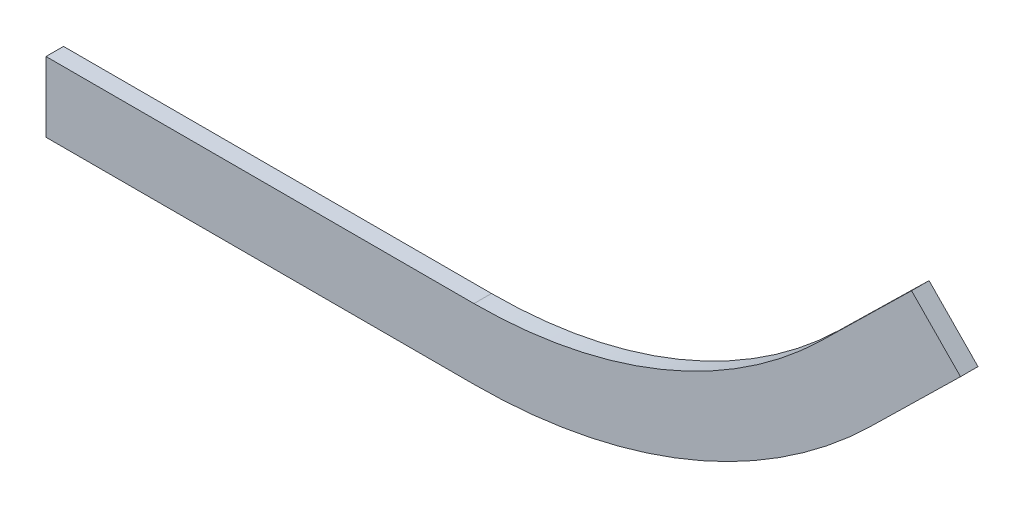
ISO-10303-21;
HEADER;
FILE_DESCRIPTION(('STEP AP214'),'2;1');
FILE_NAME('part.step','',(''),(''),'','','');
FILE_SCHEMA(('AUTOMOTIVE_DESIGN { 1 0 10303 214 1 1 1 1 }'));
ENDSEC;
DATA;
#1=APPLICATION_CONTEXT('core data for automotive mechanical design processes');
#2=APPLICATION_PROTOCOL_DEFINITION('international standard','automotive_design',2000,#1);
#3=PRODUCT_CONTEXT('',#1,'mechanical');
#4=PRODUCT('Part','Part','',(#3));
#5=PRODUCT_RELATED_PRODUCT_CATEGORY('part','',(#4));
#6=PRODUCT_DEFINITION_FORMATION('','',#4);
#7=PRODUCT_DEFINITION_CONTEXT('part definition',#1,'design');
#8=PRODUCT_DEFINITION('design','',#6,#7);
#9=PRODUCT_DEFINITION_SHAPE('','',#8);
#10=(LENGTH_UNIT() NAMED_UNIT(*) SI_UNIT(.MILLI.,.METRE.));
#11=(NAMED_UNIT(*) PLANE_ANGLE_UNIT() SI_UNIT($,.RADIAN.));
#12=(NAMED_UNIT(*) SI_UNIT($,.STERADIAN.) SOLID_ANGLE_UNIT());
#13=UNCERTAINTY_MEASURE_WITH_UNIT(LENGTH_MEASURE(1.E-05),#10,'distance_accuracy_value','');
#14=(GEOMETRIC_REPRESENTATION_CONTEXT(3) GLOBAL_UNCERTAINTY_ASSIGNED_CONTEXT((#13)) GLOBAL_UNIT_ASSIGNED_CONTEXT((#10,
#11,#12)) REPRESENTATION_CONTEXT('',''));
#15=CARTESIAN_POINT('',(0.,0.,0.));
#16=DIRECTION('',(0.,0.,1.));
#17=DIRECTION('',(1.,0.,0.));
#18=AXIS2_PLACEMENT_3D('',#15,#16,#17);
#19=CARTESIAN_POINT('',(494.796861894852,171.441265278339,-5.));
#20=DIRECTION('',(0.714607456033303,0.699525684861972,0.));
#21=DIRECTION('',(-0.699525684861972,0.714607456033303,0.));
#22=AXIS2_PLACEMENT_3D('',#19,#20,#21);
#23=PLANE('',#22);
#24=DIRECTION('',(-0.699525684861972,0.714607456033303,0.));
#25=VECTOR('',#24,1.);
#26=CARTESIAN_POINT('',(494.796861894852,171.441265278339,5.));
#27=LINE('',#26,#25);
#28=CARTESIAN_POINT('',(522.777889287821,142.85696703855,5.));
#29=VERTEX_POINT('',#28);
#30=CARTESIAN_POINT('',(494.796861894852,171.441265278339,5.));
#31=VERTEX_POINT('',#30);
#32=EDGE_CURVE('E148',#29,#31,#27,.T.);
#33=ORIENTED_EDGE('',*,*,#32,.F.);
#34=DIRECTION('',(0.,0.,1.));
#35=VECTOR('',#34,1.);
#36=CARTESIAN_POINT('',(522.777889287821,142.85696703855,-5.));
#37=LINE('',#36,#35);
#38=CARTESIAN_POINT('',(522.777889287821,142.85696703855,-5.));
#39=VERTEX_POINT('',#38);
#40=EDGE_CURVE('E47',#39,#29,#37,.T.);
#41=ORIENTED_EDGE('',*,*,#40,.F.);
#42=DIRECTION('',(-0.699525684861972,0.714607456033303,0.));
#43=VECTOR('',#42,1.);
#44=CARTESIAN_POINT('',(494.796861894852,171.441265278339,-5.));
#45=LINE('',#44,#43);
#46=CARTESIAN_POINT('',(494.796861894852,171.441265278339,-5.));
#47=VERTEX_POINT('',#46);
#48=EDGE_CURVE('E121',#39,#47,#45,.T.);
#49=ORIENTED_EDGE('',*,*,#48,.T.);
#50=DIRECTION('',(0.,0.,1.));
#51=VECTOR('',#50,1.);
#52=CARTESIAN_POINT('',(494.796861894852,171.441265278339,-5.));
#53=LINE('',#52,#51);
#54=EDGE_CURVE('E11',#47,#31,#53,.T.);
#55=ORIENTED_EDGE('',*,*,#54,.T.);
#56=EDGE_LOOP('',(#33,#41,#49,#55));
#57=FACE_BOUND('',#56,.T.);
#58=ADVANCED_FACE('F37',(#57),#23,.T.);
#59=CARTESIAN_POINT('',(487.047516486156,107.880682795451,-5.));
#60=DIRECTION('',(0.69952568486197,-0.714607456033304,0.));
#61=DIRECTION('',(0.714607456033304,0.69952568486197,0.));
#62=AXIS2_PLACEMENT_3D('',#59,#60,#61);
#63=PLANE('',#62);
#64=DIRECTION('',(0.714607456033304,0.69952568486197,0.));
#65=VECTOR('',#64,1.);
#66=CARTESIAN_POINT('',(487.047516486156,107.880682795451,5.));
#67=LINE('',#66,#65);
#68=CARTESIAN_POINT('',(471.305428265923,92.4708309163476,5.));
#69=VERTEX_POINT('',#68);
#70=EDGE_CURVE('E107',#69,#29,#67,.T.);
#71=ORIENTED_EDGE('',*,*,#70,.F.);
#72=DIRECTION('',(0.,0.,1.));
#73=VECTOR('',#72,1.);
#74=CARTESIAN_POINT('',(471.305428265923,92.4708309163476,-5.));
#75=LINE('',#74,#73);
#76=CARTESIAN_POINT('',(471.305428265923,92.4708309163476,-5.));
#77=VERTEX_POINT('',#76);
#78=EDGE_CURVE('E103',#77,#69,#75,.T.);
#79=ORIENTED_EDGE('',*,*,#78,.F.);
#80=DIRECTION('',(0.714607456033303,0.699525684861972,0.));
#81=VECTOR('',#80,1.);
#82=CARTESIAN_POINT('',(471.305428261894,92.4708309204644,-5.));
#83=LINE('',#82,#81);
#84=EDGE_CURVE('E106',#77,#39,#83,.T.);
#85=ORIENTED_EDGE('',*,*,#84,.T.);
#86=ORIENTED_EDGE('',*,*,#40,.T.);
#87=EDGE_LOOP('',(#71,#79,#85,#86));
#88=FACE_BOUND('',#87,.T.);
#89=ADVANCED_FACE('F105',(#88),#63,.T.);
#90=CARTESIAN_POINT('',(244.650168028876,324.012777723523,-5.));
#91=DIRECTION('',(0.,0.,1.));
#92=DIRECTION('',(1.,0.,0.));
#93=AXIS2_PLACEMENT_3D('',#90,#91,#92);
#94=CYLINDRICAL_SURFACE('',#93,324.012777717764);
#95=CARTESIAN_POINT('',(244.650168028876,324.012777723523,5.));
#96=DIRECTION('',(0.,0.,1.));
#97=DIRECTION('',(1.,0.,0.));
#98=AXIS2_PLACEMENT_3D('',#95,#96,#97);
#99=CIRCLE('',#98,324.012777717764);
#100=CARTESIAN_POINT('',(244.650168028876,-9.43689570931383E-13,5.));
#101=VERTEX_POINT('',#100);
#102=EDGE_CURVE('E145',#101,#69,#99,.T.);
#103=ORIENTED_EDGE('',*,*,#102,.F.);
#104=DIRECTION('',(0.,0.,1.));
#105=VECTOR('',#104,1.);
#106=CARTESIAN_POINT('',(244.650168028876,-9.43689570931383E-13,-5.));
#107=LINE('',#106,#105);
#108=CARTESIAN_POINT('',(244.650168028876,-9.43689570931383E-13,-5.));
#109=VERTEX_POINT('',#108);
#110=EDGE_CURVE('E112',#109,#101,#107,.T.);
#111=ORIENTED_EDGE('',*,*,#110,.F.);
#112=CARTESIAN_POINT('',(244.650168028876,324.012777723523,-5.));
#113=DIRECTION('',(0.,0.,1.));
#114=DIRECTION('',(1.,0.,0.));
#115=AXIS2_PLACEMENT_3D('',#112,#113,#114);
#116=CIRCLE('',#115,324.012777717764);
#117=EDGE_CURVE('E119',#109,#77,#116,.T.);
#118=ORIENTED_EDGE('',*,*,#117,.T.);
#119=ORIENTED_EDGE('',*,*,#78,.T.);
#120=EDGE_LOOP('',(#103,#111,#118,#119));
#121=FACE_BOUND('',#120,.T.);
#122=ADVANCED_FACE('F124',(#121),#94,.T.);
#123=CARTESIAN_POINT('',(50.,-9.43689570931383E-13,-5.));
#124=DIRECTION('',(0.,-1.,0.));
#125=DIRECTION('',(0.,0.,-1.));
#126=AXIS2_PLACEMENT_3D('',#123,#124,#125);
#127=PLANE('',#126);
#128=DIRECTION('',(1.,0.,0.));
#129=VECTOR('',#128,1.);
#130=CARTESIAN_POINT('',(50.,-9.43689570931383E-13,5.));
#131=LINE('',#130,#129);
#132=CARTESIAN_POINT('',(0.,0.,5.));
#133=VERTEX_POINT('',#132);
#134=EDGE_CURVE('E142',#133,#101,#131,.T.);
#135=ORIENTED_EDGE('',*,*,#134,.F.);
#136=DIRECTION('',(0.,0.,1.));
#137=VECTOR('',#136,1.);
#138=CARTESIAN_POINT('',(0.,0.,-5.));
#139=LINE('',#138,#137);
#140=CARTESIAN_POINT('',(0.,0.,-5.));
#141=VERTEX_POINT('',#140);
#142=EDGE_CURVE('E153',#141,#133,#139,.T.);
#143=ORIENTED_EDGE('',*,*,#142,.F.);
#144=DIRECTION('',(1.,0.,0.));
#145=VECTOR('',#144,1.);
#146=CARTESIAN_POINT('',(0.,0.,-5.));
#147=LINE('',#146,#145);
#148=EDGE_CURVE('E125',#141,#109,#147,.T.);
#149=ORIENTED_EDGE('',*,*,#148,.T.);
#150=ORIENTED_EDGE('',*,*,#110,.T.);
#151=EDGE_LOOP('',(#135,#143,#149,#150));
#152=FACE_BOUND('',#151,.T.);
#153=ADVANCED_FACE('F179',(#152),#127,.T.);
#154=CARTESIAN_POINT('',(6.10622663543836E-13,39.9999999999999,-5.));
#155=DIRECTION('',(-1.,0.,0.));
#156=DIRECTION('',(0.,-1.,0.));
#157=AXIS2_PLACEMENT_3D('',#154,#155,#156);
#158=PLANE('',#157);
#159=DIRECTION('',(0.,-1.,0.));
#160=VECTOR('',#159,1.);
#161=CARTESIAN_POINT('',(6.10622663543836E-13,39.9999999999999,5.));
#162=LINE('',#161,#160);
#163=CARTESIAN_POINT('',(6.10622663543836E-13,39.9999999999999,5.));
#164=VERTEX_POINT('',#163);
#165=EDGE_CURVE('E139',#164,#133,#162,.T.);
#166=ORIENTED_EDGE('',*,*,#165,.F.);
#167=DIRECTION('',(0.,0.,1.));
#168=VECTOR('',#167,1.);
#169=CARTESIAN_POINT('',(6.10622663543836E-13,39.9999999999999,-5.));
#170=LINE('',#169,#168);
#171=CARTESIAN_POINT('',(6.10622663543836E-13,39.9999999999999,-5.));
#172=VERTEX_POINT('',#171);
#173=EDGE_CURVE('E156',#172,#164,#170,.T.);
#174=ORIENTED_EDGE('',*,*,#173,.F.);
#175=DIRECTION('',(0.,-1.,0.));
#176=VECTOR('',#175,1.);
#177=CARTESIAN_POINT('',(6.10622663543836E-13,39.9999999999999,-5.));
#178=LINE('',#177,#176);
#179=EDGE_CURVE('E127',#172,#141,#178,.T.);
#180=ORIENTED_EDGE('',*,*,#179,.T.);
#181=ORIENTED_EDGE('',*,*,#142,.T.);
#182=EDGE_LOOP('',(#166,#174,#180,#181));
#183=FACE_BOUND('',#182,.T.);
#184=ADVANCED_FACE('F182',(#183),#158,.T.);
#185=CARTESIAN_POINT('',(6.10622663543836E-13,39.9999999999999,-5.));
#186=DIRECTION('',(0.,1.,0.));
#187=DIRECTION('',(-1.,0.,0.));
#188=AXIS2_PLACEMENT_3D('',#185,#186,#187);
#189=PLANE('',#188);
#190=DIRECTION('',(-1.,0.,0.));
#191=VECTOR('',#190,1.);
#192=CARTESIAN_POINT('',(6.10622663543836E-13,39.9999999999999,5.));
#193=LINE('',#192,#191);
#194=CARTESIAN_POINT('',(244.655381072134,39.9999999999964,5.));
#195=VERTEX_POINT('',#194);
#196=EDGE_CURVE('E136',#195,#164,#193,.T.);
#197=ORIENTED_EDGE('',*,*,#196,.F.);
#198=DIRECTION('',(0.,0.,1.));
#199=VECTOR('',#198,1.);
#200=CARTESIAN_POINT('',(244.655381072134,39.9999999999964,-5.));
#201=LINE('',#200,#199);
#202=CARTESIAN_POINT('',(244.655381072134,39.9999999999964,-5.));
#203=VERTEX_POINT('',#202);
#204=EDGE_CURVE('E157',#203,#195,#201,.T.);
#205=ORIENTED_EDGE('',*,*,#204,.F.);
#206=DIRECTION('',(-1.,0.,0.));
#207=VECTOR('',#206,1.);
#208=CARTESIAN_POINT('',(50.0000000000006,39.999999999999,-5.));
#209=LINE('',#208,#207);
#210=EDGE_CURVE('E269',#203,#172,#209,.T.);
#211=ORIENTED_EDGE('',*,*,#210,.T.);
#212=ORIENTED_EDGE('',*,*,#173,.T.);
#213=EDGE_LOOP('',(#197,#205,#211,#212));
#214=FACE_BOUND('',#213,.T.);
#215=ADVANCED_FACE('F186',(#214),#189,.T.);
#216=CARTESIAN_POINT('',(244.655381072137,323.999999999996,-5.));
#217=DIRECTION('',(0.,0.,1.));
#218=DIRECTION('',(1.,0.,0.));
#219=AXIS2_PLACEMENT_3D('',#216,#217,#218);
#220=CYLINDRICAL_SURFACE('',#219,284.);
#221=CARTESIAN_POINT('',(244.655381072137,323.999999999996,5.));
#222=DIRECTION('',(0.,0.,-1.));
#223=DIRECTION('',(1.,0.,0.));
#224=AXIS2_PLACEMENT_3D('',#221,#222,#223);
#225=CIRCLE('',#224,284.);
#226=CARTESIAN_POINT('',(443.320675572937,121.051482486538,5.));
#227=VERTEX_POINT('',#226);
#228=EDGE_CURVE('E133',#227,#195,#225,.T.);
#229=ORIENTED_EDGE('',*,*,#228,.F.);
#230=DIRECTION('',(0.,0.,1.));
#231=VECTOR('',#230,1.);
#232=CARTESIAN_POINT('',(443.320675572937,121.051482486538,-5.));
#233=LINE('',#232,#231);
#234=CARTESIAN_POINT('',(443.320675572937,121.051482486538,-5.));
#235=VERTEX_POINT('',#234);
#236=EDGE_CURVE('E41',#235,#227,#233,.T.);
#237=ORIENTED_EDGE('',*,*,#236,.F.);
#238=CARTESIAN_POINT('',(244.655381072137,323.999999999996,-5.));
#239=DIRECTION('',(0.,0.,-1.));
#240=DIRECTION('',(1.,0.,0.));
#241=AXIS2_PLACEMENT_3D('',#238,#239,#240);
#242=CIRCLE('',#241,284.);
#243=EDGE_CURVE('E270',#235,#203,#242,.T.);
#244=ORIENTED_EDGE('',*,*,#243,.T.);
#245=ORIENTED_EDGE('',*,*,#204,.T.);
#246=EDGE_LOOP('',(#229,#237,#244,#245));
#247=FACE_BOUND('',#246,.T.);
#248=ADVANCED_FACE('F163',(#247),#220,.F.);
#249=CARTESIAN_POINT('',(443.320675572937,121.051482486538,-5.));
#250=DIRECTION('',(-0.699525684861968,0.714607456033307,0.));
#251=DIRECTION('',(-0.714607456033307,-0.699525684861968,0.));
#252=AXIS2_PLACEMENT_3D('',#249,#250,#251);
#253=PLANE('',#252);
#254=DIRECTION('',(-0.714607456033306,-0.699525684861968,0.));
#255=VECTOR('',#254,1.);
#256=CARTESIAN_POINT('',(443.320675572937,121.051482486538,5.));
#257=LINE('',#256,#255);
#258=EDGE_CURVE('E85',#31,#227,#257,.T.);
#259=ORIENTED_EDGE('',*,*,#258,.F.);
#260=ORIENTED_EDGE('',*,*,#54,.F.);
#261=DIRECTION('',(-0.714607456033303,-0.699525684861972,0.));
#262=VECTOR('',#261,1.);
#263=CARTESIAN_POINT('',(459.066489093187,136.464981035241,-5.));
#264=LINE('',#263,#262);
#265=EDGE_CURVE('E88',#47,#235,#264,.T.);
#266=ORIENTED_EDGE('',*,*,#265,.T.);
#267=ORIENTED_EDGE('',*,*,#236,.T.);
#268=EDGE_LOOP('',(#259,#260,#266,#267));
#269=FACE_BOUND('',#268,.T.);
#270=ADVANCED_FACE('F39',(#269),#253,.T.);
#271=CARTESIAN_POINT('',(244.650168028876,324.012777723523,-5.));
#272=DIRECTION('',(0.,0.,1.));
#273=DIRECTION('',(1.,0.,0.));
#274=AXIS2_PLACEMENT_3D('',#271,#272,#273);
#275=PLANE('',#274);
#276=ORIENTED_EDGE('',*,*,#265,.F.);
#277=ORIENTED_EDGE('',*,*,#48,.F.);
#278=ORIENTED_EDGE('',*,*,#84,.F.);
#279=ORIENTED_EDGE('',*,*,#117,.F.);
#280=ORIENTED_EDGE('',*,*,#148,.F.);
#281=ORIENTED_EDGE('',*,*,#179,.F.);
#282=ORIENTED_EDGE('',*,*,#210,.F.);
#283=ORIENTED_EDGE('',*,*,#243,.F.);
#284=EDGE_LOOP('',(#276,#277,#278,#279,#280,#281,#282,#283));
#285=FACE_BOUND('',#284,.T.);
#286=ADVANCED_FACE('F117',(#285),#275,.F.);
#287=CARTESIAN_POINT('',(244.650168028876,324.012777723523,5.));
#288=DIRECTION('',(0.,0.,1.));
#289=DIRECTION('',(1.,0.,0.));
#290=AXIS2_PLACEMENT_3D('',#287,#288,#289);
#291=PLANE('',#290);
#292=ORIENTED_EDGE('',*,*,#32,.T.);
#293=ORIENTED_EDGE('',*,*,#258,.T.);
#294=ORIENTED_EDGE('',*,*,#228,.T.);
#295=ORIENTED_EDGE('',*,*,#196,.T.);
#296=ORIENTED_EDGE('',*,*,#165,.T.);
#297=ORIENTED_EDGE('',*,*,#134,.T.);
#298=ORIENTED_EDGE('',*,*,#102,.T.);
#299=ORIENTED_EDGE('',*,*,#70,.T.);
#300=EDGE_LOOP('',(#292,#293,#294,#295,#296,#297,#298,#299));
#301=FACE_BOUND('',#300,.T.);
#302=ADVANCED_FACE('F165',(#301),#291,.T.);
#303=CLOSED_SHELL('',(#58,#89,#122,#153,#184,#215,#248,#270,#286,#302));
#304=MANIFOLD_SOLID_BREP('B2',#303);
#305=ADVANCED_BREP_SHAPE_REPRESENTATION('',(#18,#304),#14);
#306=SHAPE_DEFINITION_REPRESENTATION(#9,#305);
ENDSEC;
END-ISO-10303-21;
